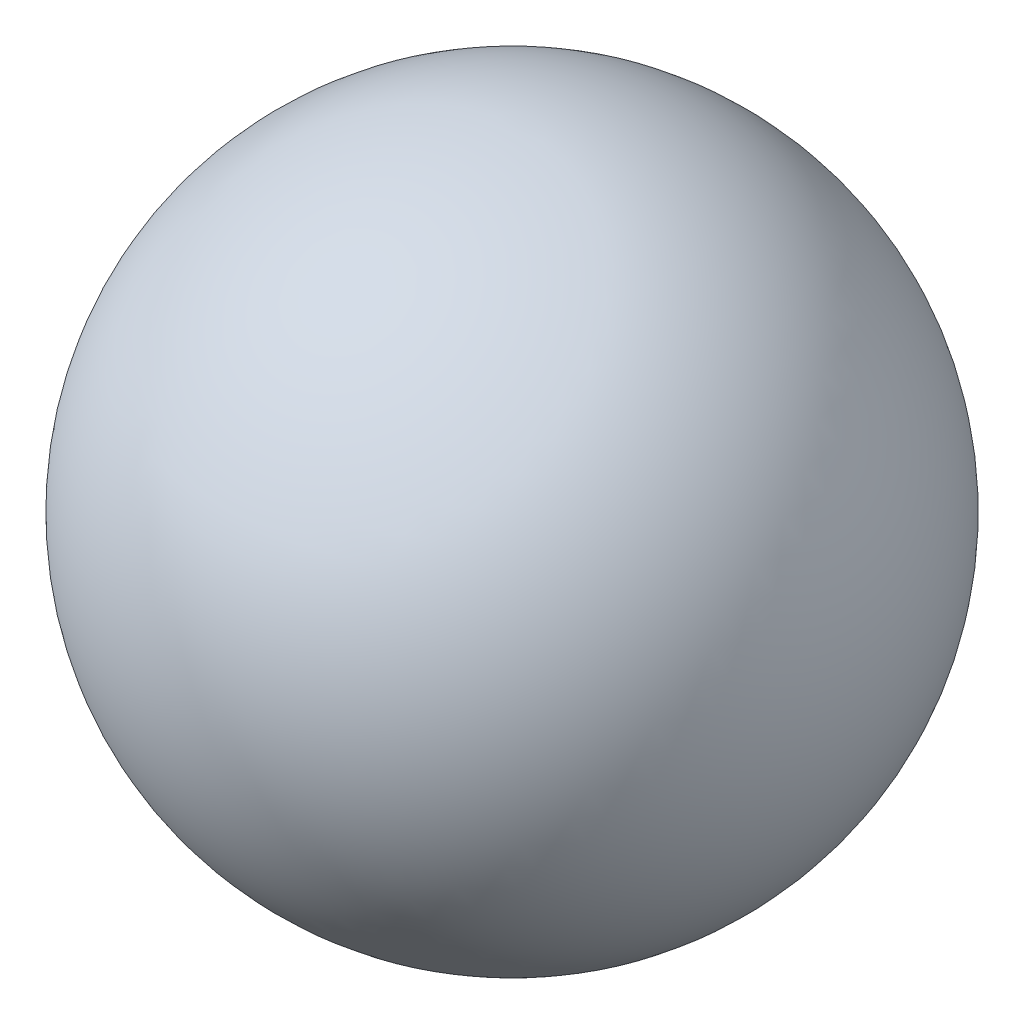
ISO-10303-21;
HEADER;
FILE_DESCRIPTION(('STEP AP214'),'2;1');
FILE_NAME('part.step','',(''),(''),'','','');
FILE_SCHEMA(('AUTOMOTIVE_DESIGN { 1 0 10303 214 1 1 1 1 }'));
ENDSEC;
DATA;
#1=APPLICATION_CONTEXT('core data for automotive mechanical design processes');
#2=APPLICATION_PROTOCOL_DEFINITION('international standard','automotive_design',2000,#1);
#3=PRODUCT_CONTEXT('',#1,'mechanical');
#4=PRODUCT('Part','Part','',(#3));
#5=PRODUCT_RELATED_PRODUCT_CATEGORY('part','',(#4));
#6=PRODUCT_DEFINITION_FORMATION('','',#4);
#7=PRODUCT_DEFINITION_CONTEXT('part definition',#1,'design');
#8=PRODUCT_DEFINITION('design','',#6,#7);
#9=PRODUCT_DEFINITION_SHAPE('','',#8);
#10=(LENGTH_UNIT() NAMED_UNIT(*) SI_UNIT(.MILLI.,.METRE.));
#11=(NAMED_UNIT(*) PLANE_ANGLE_UNIT() SI_UNIT($,.RADIAN.));
#12=(NAMED_UNIT(*) SI_UNIT($,.STERADIAN.) SOLID_ANGLE_UNIT());
#13=UNCERTAINTY_MEASURE_WITH_UNIT(LENGTH_MEASURE(1.E-05),#10,'distance_accuracy_value','');
#14=(GEOMETRIC_REPRESENTATION_CONTEXT(3) GLOBAL_UNCERTAINTY_ASSIGNED_CONTEXT((#13)) GLOBAL_UNIT_ASSIGNED_CONTEXT((#10,
#11,#12)) REPRESENTATION_CONTEXT('',''));
#15=CARTESIAN_POINT('',(0.,0.,0.));
#16=DIRECTION('',(0.,0.,1.));
#17=DIRECTION('',(1.,0.,0.));
#18=AXIS2_PLACEMENT_3D('',#15,#16,#17);
#19=CARTESIAN_POINT('',(0.,3.96875,0.));
#20=DIRECTION('',(0.,1.,0.));
#21=DIRECTION('',(-1.,0.,0.));
#22=AXIS2_PLACEMENT_3D('',#19,#20,#21);
#23=SPHERICAL_SURFACE('',#22,0.758760243513405);
#24=CARTESIAN_POINT('',(0.,4.7275102435134,0.));
#25=VERTEX_POINT('',#24);
#26=VERTEX_LOOP('',#25);
#27=FACE_BOUND('',#26,.T.);
#28=ADVANCED_FACE('F34',(#27),#23,.T.);
#29=CLOSED_SHELL('',(#28));
#30=MANIFOLD_SOLID_BREP('B2',#29);
#31=ADVANCED_BREP_SHAPE_REPRESENTATION('',(#18,#30),#14);
#32=SHAPE_DEFINITION_REPRESENTATION(#9,#31);
ENDSEC;
END-ISO-10303-21;
